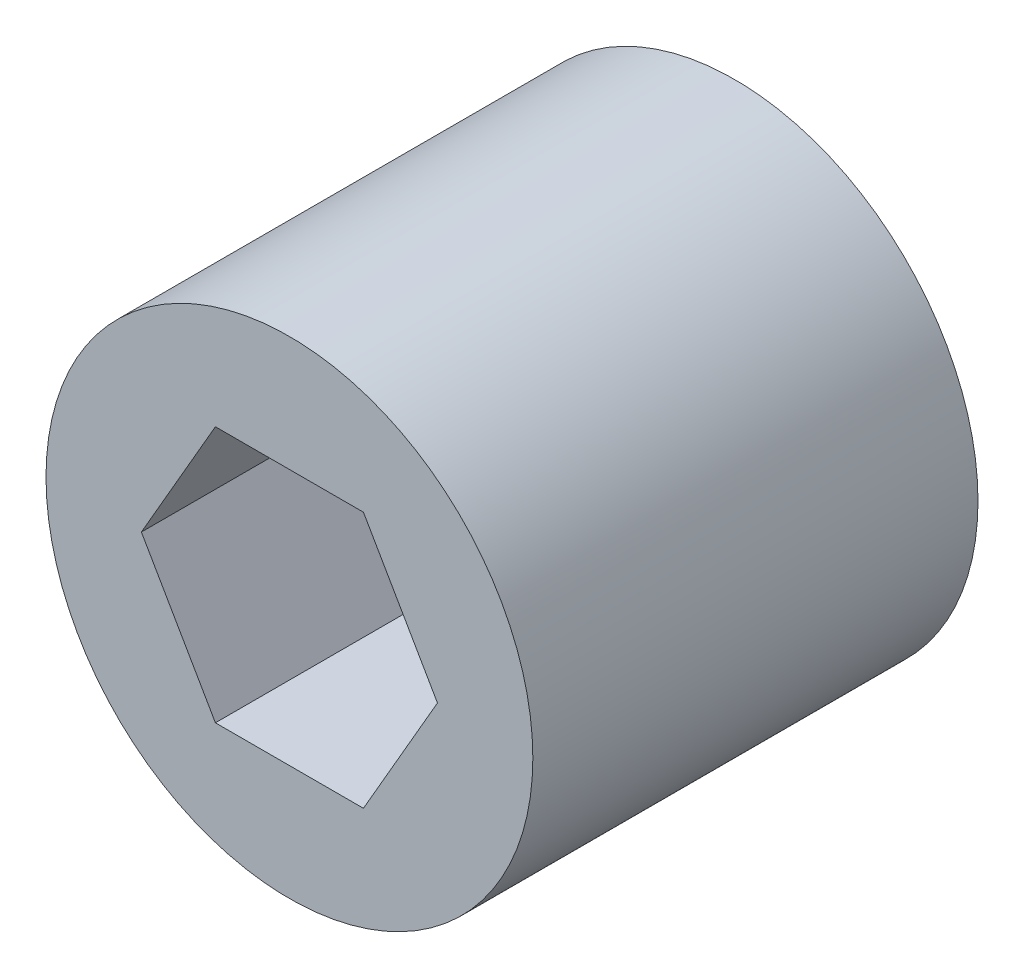
ISO-10303-21;
HEADER;
FILE_DESCRIPTION(('STEP AP214'),'2;1');
FILE_NAME('part.step','',(''),(''),'','','');
FILE_SCHEMA(('AUTOMOTIVE_DESIGN { 1 0 10303 214 1 1 1 1 }'));
ENDSEC;
DATA;
#1=APPLICATION_CONTEXT('core data for automotive mechanical design processes');
#2=APPLICATION_PROTOCOL_DEFINITION('international standard','automotive_design',2000,#1);
#3=PRODUCT_CONTEXT('',#1,'mechanical');
#4=PRODUCT('Part','Part','',(#3));
#5=PRODUCT_RELATED_PRODUCT_CATEGORY('part','',(#4));
#6=PRODUCT_DEFINITION_FORMATION('','',#4);
#7=PRODUCT_DEFINITION_CONTEXT('part definition',#1,'design');
#8=PRODUCT_DEFINITION('design','',#6,#7);
#9=PRODUCT_DEFINITION_SHAPE('','',#8);
#10=(LENGTH_UNIT() NAMED_UNIT(*) SI_UNIT(.MILLI.,.METRE.));
#11=(NAMED_UNIT(*) PLANE_ANGLE_UNIT() SI_UNIT($,.RADIAN.));
#12=(NAMED_UNIT(*) SI_UNIT($,.STERADIAN.) SOLID_ANGLE_UNIT());
#13=UNCERTAINTY_MEASURE_WITH_UNIT(LENGTH_MEASURE(1.E-05),#10,'distance_accuracy_value','');
#14=(GEOMETRIC_REPRESENTATION_CONTEXT(3) GLOBAL_UNCERTAINTY_ASSIGNED_CONTEXT((#13)) GLOBAL_UNIT_ASSIGNED_CONTEXT((#10,
#11,#12)) REPRESENTATION_CONTEXT('',''));
#15=CARTESIAN_POINT('',(0.,0.,0.));
#16=DIRECTION('',(0.,0.,1.));
#17=DIRECTION('',(1.,0.,0.));
#18=AXIS2_PLACEMENT_3D('',#15,#16,#17);
#19=CARTESIAN_POINT('',(0.,0.,8.709249917));
#20=DIRECTION('',(0.,0.,1.));
#21=DIRECTION('',(1.,0.,0.));
#22=AXIS2_PLACEMENT_3D('',#19,#20,#21);
#23=PLANE('',#22);
#24=CARTESIAN_POINT('',(0.,0.,8.709249917));
#25=DIRECTION('',(0.,0.,1.));
#26=DIRECTION('',(1.,0.,0.));
#27=AXIS2_PLACEMENT_3D('',#24,#25,#26);
#28=CIRCLE('',#27,9.525);
#29=CARTESIAN_POINT('',(9.525,0.,8.709249917));
#30=VERTEX_POINT('',#29);
#31=EDGE_CURVE('E11',#30,#30,#28,.T.);
#32=ORIENTED_EDGE('',*,*,#31,.T.);
#33=EDGE_LOOP('',(#32));
#34=FACE_BOUND('',#33,.T.);
#35=DIRECTION('',(0.5,-0.866025403784439,0.));
#36=VECTOR('',#35,1.);
#37=CARTESIAN_POINT('',(-5.79255525077951,0.,8.709249917));
#38=LINE('',#37,#36);
#39=CARTESIAN_POINT('',(-5.79255525077951,0.,8.709249917));
#40=VERTEX_POINT('',#39);
#41=CARTESIAN_POINT('',(-2.89627762538976,-5.0165,8.709249917));
#42=VERTEX_POINT('',#41);
#43=EDGE_CURVE('E108',#40,#42,#38,.T.);
#44=ORIENTED_EDGE('',*,*,#43,.F.);
#45=DIRECTION('',(-0.5,-0.866025403784439,0.));
#46=VECTOR('',#45,1.);
#47=CARTESIAN_POINT('',(-2.89627762538976,5.0165,8.709249917));
#48=LINE('',#47,#46);
#49=CARTESIAN_POINT('',(-2.89627762538976,5.0165,8.709249917));
#50=VERTEX_POINT('',#49);
#51=EDGE_CURVE('E99',#50,#40,#48,.T.);
#52=ORIENTED_EDGE('',*,*,#51,.F.);
#53=DIRECTION('',(-1.,0.,0.));
#54=VECTOR('',#53,1.);
#55=CARTESIAN_POINT('',(2.89627762538976,5.0165,8.709249917));
#56=LINE('',#55,#54);
#57=CARTESIAN_POINT('',(2.89627762538976,5.0165,8.709249917));
#58=VERTEX_POINT('',#57);
#59=EDGE_CURVE('E133',#58,#50,#56,.T.);
#60=ORIENTED_EDGE('',*,*,#59,.F.);
#61=DIRECTION('',(-0.5,0.866025403784439,0.));
#62=VECTOR('',#61,1.);
#63=CARTESIAN_POINT('',(5.79255525077951,0.,8.709249917));
#64=LINE('',#63,#62);
#65=CARTESIAN_POINT('',(5.79255525077951,0.,8.709249917));
#66=VERTEX_POINT('',#65);
#67=EDGE_CURVE('E130',#66,#58,#64,.T.);
#68=ORIENTED_EDGE('',*,*,#67,.F.);
#69=DIRECTION('',(0.5,0.866025403784439,0.));
#70=VECTOR('',#69,1.);
#71=CARTESIAN_POINT('',(2.89627762538975,-5.0165,8.709249917));
#72=LINE('',#71,#70);
#73=CARTESIAN_POINT('',(2.89627762538975,-5.0165,8.709249917));
#74=VERTEX_POINT('',#73);
#75=EDGE_CURVE('E125',#74,#66,#72,.T.);
#76=ORIENTED_EDGE('',*,*,#75,.F.);
#77=DIRECTION('',(1.,0.,0.));
#78=VECTOR('',#77,1.);
#79=CARTESIAN_POINT('',(-2.89627762538976,-5.0165,8.709249917));
#80=LINE('',#79,#78);
#81=EDGE_CURVE('E121',#42,#74,#80,.T.);
#82=ORIENTED_EDGE('',*,*,#81,.F.);
#83=EDGE_LOOP('',(#44,#52,#60,#68,#76,#82));
#84=FACE_BOUND('',#83,.T.);
#85=ADVANCED_FACE('F45',(#34,#84),#23,.T.);
#86=CARTESIAN_POINT('',(0.,0.,-8.709249917));
#87=DIRECTION('',(0.,0.,1.));
#88=DIRECTION('',(1.,0.,0.));
#89=AXIS2_PLACEMENT_3D('',#86,#87,#88);
#90=PLANE('',#89);
#91=CARTESIAN_POINT('',(0.,0.,-8.709249917));
#92=DIRECTION('',(0.,0.,1.));
#93=DIRECTION('',(1.,0.,0.));
#94=AXIS2_PLACEMENT_3D('',#91,#92,#93);
#95=CIRCLE('',#94,9.525);
#96=CARTESIAN_POINT('',(9.525,0.,-8.709249917));
#97=VERTEX_POINT('',#96);
#98=EDGE_CURVE('E49',#97,#97,#95,.T.);
#99=ORIENTED_EDGE('',*,*,#98,.F.);
#100=EDGE_LOOP('',(#99));
#101=FACE_BOUND('',#100,.T.);
#102=DIRECTION('',(-0.5,-0.866025403784439,0.));
#103=VECTOR('',#102,1.);
#104=CARTESIAN_POINT('',(-2.89627762538976,5.0165,-8.709249917));
#105=LINE('',#104,#103);
#106=CARTESIAN_POINT('',(-2.89627762538976,5.0165,-8.709249917));
#107=VERTEX_POINT('',#106);
#108=CARTESIAN_POINT('',(-5.79255525077951,0.,-8.709249917));
#109=VERTEX_POINT('',#108);
#110=EDGE_CURVE('E69',#107,#109,#105,.T.);
#111=ORIENTED_EDGE('',*,*,#110,.T.);
#112=DIRECTION('',(0.5,-0.866025403784439,0.));
#113=VECTOR('',#112,1.);
#114=CARTESIAN_POINT('',(-5.79255525077951,0.,-8.709249917));
#115=LINE('',#114,#113);
#116=CARTESIAN_POINT('',(-2.89627762538976,-5.0165,-8.709249917));
#117=VERTEX_POINT('',#116);
#118=EDGE_CURVE('E115',#109,#117,#115,.T.);
#119=ORIENTED_EDGE('',*,*,#118,.T.);
#120=DIRECTION('',(1.,0.,0.));
#121=VECTOR('',#120,1.);
#122=CARTESIAN_POINT('',(-2.89627762538976,-5.0165,-8.709249917));
#123=LINE('',#122,#121);
#124=CARTESIAN_POINT('',(2.89627762538975,-5.0165,-8.709249917));
#125=VERTEX_POINT('',#124);
#126=EDGE_CURVE('E140',#117,#125,#123,.T.);
#127=ORIENTED_EDGE('',*,*,#126,.T.);
#128=DIRECTION('',(0.5,0.866025403784439,0.));
#129=VECTOR('',#128,1.);
#130=CARTESIAN_POINT('',(2.89627762538975,-5.0165,-8.709249917));
#131=LINE('',#130,#129);
#132=CARTESIAN_POINT('',(5.79255525077951,0.,-8.709249917));
#133=VERTEX_POINT('',#132);
#134=EDGE_CURVE('E144',#125,#133,#131,.T.);
#135=ORIENTED_EDGE('',*,*,#134,.T.);
#136=DIRECTION('',(-0.5,0.866025403784439,0.));
#137=VECTOR('',#136,1.);
#138=CARTESIAN_POINT('',(5.79255525077951,0.,-8.709249917));
#139=LINE('',#138,#137);
#140=CARTESIAN_POINT('',(2.89627762538976,5.0165,-8.709249917));
#141=VERTEX_POINT('',#140);
#142=EDGE_CURVE('E148',#133,#141,#139,.T.);
#143=ORIENTED_EDGE('',*,*,#142,.T.);
#144=DIRECTION('',(-1.,0.,0.));
#145=VECTOR('',#144,1.);
#146=CARTESIAN_POINT('',(2.89627762538976,5.0165,-8.709249917));
#147=LINE('',#146,#145);
#148=EDGE_CURVE('E109',#141,#107,#147,.T.);
#149=ORIENTED_EDGE('',*,*,#148,.T.);
#150=EDGE_LOOP('',(#111,#119,#127,#135,#143,#149));
#151=FACE_BOUND('',#150,.T.);
#152=ADVANCED_FACE('F172',(#101,#151),#90,.F.);
#153=CARTESIAN_POINT('',(0.,0.,8.709249917));
#154=DIRECTION('',(0.,0.,-1.));
#155=DIRECTION('',(-1.,0.,0.));
#156=AXIS2_PLACEMENT_3D('',#153,#154,#155);
#157=CYLINDRICAL_SURFACE('',#156,9.525);
#158=ORIENTED_EDGE('',*,*,#31,.F.);
#159=EDGE_LOOP('',(#158));
#160=FACE_BOUND('',#159,.T.);
#161=ORIENTED_EDGE('',*,*,#98,.T.);
#162=EDGE_LOOP('',(#161));
#163=FACE_BOUND('',#162,.T.);
#164=ADVANCED_FACE('F47',(#160,#163),#157,.T.);
#165=CARTESIAN_POINT('',(-2.89627762538976,5.0165,8.709249917));
#166=DIRECTION('',(0.866025403784439,-0.5,0.));
#167=DIRECTION('',(0.5,0.866025403784439,0.));
#168=AXIS2_PLACEMENT_3D('',#165,#166,#167);
#169=PLANE('',#168);
#170=ORIENTED_EDGE('',*,*,#110,.F.);
#171=DIRECTION('',(0.,0.,-1.));
#172=VECTOR('',#171,1.);
#173=CARTESIAN_POINT('',(-2.89627762538976,5.0165,8.709249917));
#174=LINE('',#173,#172);
#175=EDGE_CURVE('E103',#50,#107,#174,.T.);
#176=ORIENTED_EDGE('',*,*,#175,.F.);
#177=ORIENTED_EDGE('',*,*,#51,.T.);
#178=DIRECTION('',(0.,0.,-1.));
#179=VECTOR('',#178,1.);
#180=CARTESIAN_POINT('',(-5.79255525077951,0.,8.709249917));
#181=LINE('',#180,#179);
#182=EDGE_CURVE('E102',#40,#109,#181,.T.);
#183=ORIENTED_EDGE('',*,*,#182,.T.);
#184=EDGE_LOOP('',(#170,#176,#177,#183));
#185=FACE_BOUND('',#184,.T.);
#186=ADVANCED_FACE('F101',(#185),#169,.T.);
#187=CARTESIAN_POINT('',(-5.79255525077951,0.,8.709249917));
#188=DIRECTION('',(0.866025403784439,0.5,0.));
#189=DIRECTION('',(-0.5,0.866025403784439,0.));
#190=AXIS2_PLACEMENT_3D('',#187,#188,#189);
#191=PLANE('',#190);
#192=ORIENTED_EDGE('',*,*,#118,.F.);
#193=ORIENTED_EDGE('',*,*,#182,.F.);
#194=ORIENTED_EDGE('',*,*,#43,.T.);
#195=DIRECTION('',(0.,0.,-1.));
#196=VECTOR('',#195,1.);
#197=CARTESIAN_POINT('',(-2.89627762538976,-5.0165,8.709249917));
#198=LINE('',#197,#196);
#199=EDGE_CURVE('E117',#42,#117,#198,.T.);
#200=ORIENTED_EDGE('',*,*,#199,.T.);
#201=EDGE_LOOP('',(#192,#193,#194,#200));
#202=FACE_BOUND('',#201,.T.);
#203=ADVANCED_FACE('F112',(#202),#191,.T.);
#204=CARTESIAN_POINT('',(-2.89627762538976,-5.0165,8.709249917));
#205=DIRECTION('',(0.,1.,0.));
#206=DIRECTION('',(-1.,0.,0.));
#207=AXIS2_PLACEMENT_3D('',#204,#205,#206);
#208=PLANE('',#207);
#209=ORIENTED_EDGE('',*,*,#126,.F.);
#210=ORIENTED_EDGE('',*,*,#199,.F.);
#211=ORIENTED_EDGE('',*,*,#81,.T.);
#212=DIRECTION('',(0.,0.,-1.));
#213=VECTOR('',#212,1.);
#214=CARTESIAN_POINT('',(2.89627762538975,-5.0165,8.709249917));
#215=LINE('',#214,#213);
#216=EDGE_CURVE('E162',#74,#125,#215,.T.);
#217=ORIENTED_EDGE('',*,*,#216,.T.);
#218=EDGE_LOOP('',(#209,#210,#211,#217));
#219=FACE_BOUND('',#218,.T.);
#220=ADVANCED_FACE('F168',(#219),#208,.T.);
#221=CARTESIAN_POINT('',(2.89627762538975,-5.0165,8.709249917));
#222=DIRECTION('',(-0.866025403784439,0.5,0.));
#223=DIRECTION('',(-0.5,-0.866025403784439,0.));
#224=AXIS2_PLACEMENT_3D('',#221,#222,#223);
#225=PLANE('',#224);
#226=ORIENTED_EDGE('',*,*,#134,.F.);
#227=ORIENTED_EDGE('',*,*,#216,.F.);
#228=ORIENTED_EDGE('',*,*,#75,.T.);
#229=DIRECTION('',(0.,0.,-1.));
#230=VECTOR('',#229,1.);
#231=CARTESIAN_POINT('',(5.79255525077951,0.,8.709249917));
#232=LINE('',#231,#230);
#233=EDGE_CURVE('E159',#66,#133,#232,.T.);
#234=ORIENTED_EDGE('',*,*,#233,.T.);
#235=EDGE_LOOP('',(#226,#227,#228,#234));
#236=FACE_BOUND('',#235,.T.);
#237=ADVANCED_FACE('F180',(#236),#225,.T.);
#238=CARTESIAN_POINT('',(5.79255525077951,0.,8.709249917));
#239=DIRECTION('',(-0.866025403784439,-0.5,0.));
#240=DIRECTION('',(0.5,-0.866025403784439,0.));
#241=AXIS2_PLACEMENT_3D('',#238,#239,#240);
#242=PLANE('',#241);
#243=ORIENTED_EDGE('',*,*,#142,.F.);
#244=ORIENTED_EDGE('',*,*,#233,.F.);
#245=ORIENTED_EDGE('',*,*,#67,.T.);
#246=DIRECTION('',(0.,0.,-1.));
#247=VECTOR('',#246,1.);
#248=CARTESIAN_POINT('',(2.89627762538976,5.0165,8.709249917));
#249=LINE('',#248,#247);
#250=EDGE_CURVE('E61',#58,#141,#249,.T.);
#251=ORIENTED_EDGE('',*,*,#250,.T.);
#252=EDGE_LOOP('',(#243,#244,#245,#251));
#253=FACE_BOUND('',#252,.T.);
#254=ADVANCED_FACE('F178',(#253),#242,.T.);
#255=CARTESIAN_POINT('',(2.89627762538976,5.0165,8.709249917));
#256=DIRECTION('',(0.,-1.,0.));
#257=DIRECTION('',(1.,0.,0.));
#258=AXIS2_PLACEMENT_3D('',#255,#256,#257);
#259=PLANE('',#258);
#260=ORIENTED_EDGE('',*,*,#148,.F.);
#261=ORIENTED_EDGE('',*,*,#250,.F.);
#262=ORIENTED_EDGE('',*,*,#59,.T.);
#263=ORIENTED_EDGE('',*,*,#175,.T.);
#264=EDGE_LOOP('',(#260,#261,#262,#263));
#265=FACE_BOUND('',#264,.T.);
#266=ADVANCED_FACE('F174',(#265),#259,.T.);
#267=CLOSED_SHELL('',(#85,#152,#164,#186,#203,#220,#237,#254,#266));
#268=MANIFOLD_SOLID_BREP('B2',#267);
#269=ADVANCED_BREP_SHAPE_REPRESENTATION('',(#18,#268),#14);
#270=SHAPE_DEFINITION_REPRESENTATION(#9,#269);
ENDSEC;
END-ISO-10303-21;
